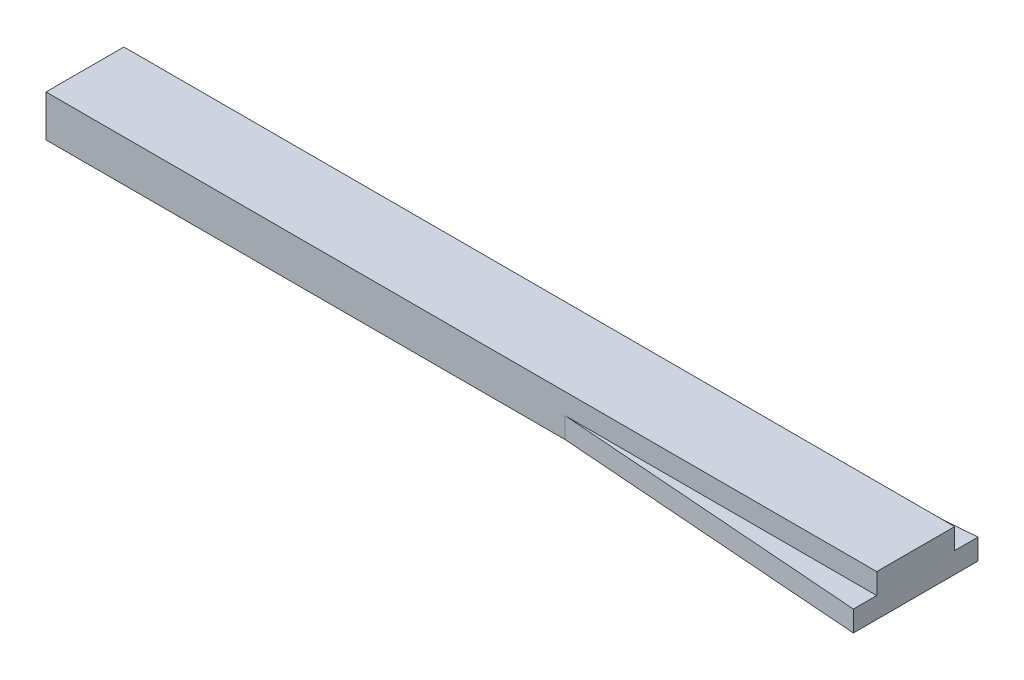
ISO-10303-21;
HEADER;
FILE_DESCRIPTION(('STEP AP214'),'2;1');
FILE_NAME('part.step','',(''),(''),'','','');
FILE_SCHEMA(('AUTOMOTIVE_DESIGN { 1 0 10303 214 1 1 1 1 }'));
ENDSEC;
DATA;
#1=APPLICATION_CONTEXT('core data for automotive mechanical design processes');
#2=APPLICATION_PROTOCOL_DEFINITION('international standard','automotive_design',2000,#1);
#3=PRODUCT_CONTEXT('',#1,'mechanical');
#4=PRODUCT('Part','Part','',(#3));
#5=PRODUCT_RELATED_PRODUCT_CATEGORY('part','',(#4));
#6=PRODUCT_DEFINITION_FORMATION('','',#4);
#7=PRODUCT_DEFINITION_CONTEXT('part definition',#1,'design');
#8=PRODUCT_DEFINITION('design','',#6,#7);
#9=PRODUCT_DEFINITION_SHAPE('','',#8);
#10=(LENGTH_UNIT() NAMED_UNIT(*) SI_UNIT(.MILLI.,.METRE.));
#11=(NAMED_UNIT(*) PLANE_ANGLE_UNIT() SI_UNIT($,.RADIAN.));
#12=(NAMED_UNIT(*) SI_UNIT($,.STERADIAN.) SOLID_ANGLE_UNIT());
#13=UNCERTAINTY_MEASURE_WITH_UNIT(LENGTH_MEASURE(1.E-05),#10,'distance_accuracy_value','');
#14=(GEOMETRIC_REPRESENTATION_CONTEXT(3) GLOBAL_UNCERTAINTY_ASSIGNED_CONTEXT((#13)) GLOBAL_UNIT_ASSIGNED_CONTEXT((#10,
#11,#12)) REPRESENTATION_CONTEXT('',''));
#15=CARTESIAN_POINT('',(0.,0.,0.));
#16=DIRECTION('',(0.,0.,1.));
#17=DIRECTION('',(1.,0.,0.));
#18=AXIS2_PLACEMENT_3D('',#15,#16,#17);
#19=CARTESIAN_POINT('',(-125.993031358885,4.,-49.616724738676));
#20=DIRECTION('',(0.,0.,-1.));
#21=DIRECTION('',(-1.,0.,0.));
#22=AXIS2_PLACEMENT_3D('',#19,#20,#21);
#23=PLANE('',#22);
#24=DIRECTION('',(0.,-1.,0.));
#25=VECTOR('',#24,1.);
#26=CARTESIAN_POINT('',(-125.993031358885,4.,-49.616724738676));
#27=LINE('',#26,#25);
#28=CARTESIAN_POINT('',(-125.993031358885,4.,-49.616724738676));
#29=VERTEX_POINT('',#28);
#30=CARTESIAN_POINT('',(-125.993031358885,-4.,-49.616724738676));
#31=VERTEX_POINT('',#30);
#32=EDGE_CURVE('E106',#29,#31,#27,.T.);
#33=ORIENTED_EDGE('',*,*,#32,.T.);
#34=DIRECTION('',(1.,0.,0.));
#35=VECTOR('',#34,1.);
#36=CARTESIAN_POINT('',(-125.993031358885,-4.,-49.616724738676));
#37=LINE('',#36,#35);
#38=CARTESIAN_POINT('',(-25.993031358885,-4.,-49.6167247386759));
#39=VERTEX_POINT('',#38);
#40=EDGE_CURVE('E109',#31,#39,#37,.T.);
#41=ORIENTED_EDGE('',*,*,#40,.T.);
#42=DIRECTION('',(0.,1.,0.));
#43=VECTOR('',#42,1.);
#44=CARTESIAN_POINT('',(-25.993031358885,-4.,-49.6167247386759));
#45=LINE('',#44,#43);
#46=CARTESIAN_POINT('',(-25.993031358885,0.,-49.6167247386759));
#47=VERTEX_POINT('',#46);
#48=EDGE_CURVE('E151',#39,#47,#45,.T.);
#49=ORIENTED_EDGE('',*,*,#48,.T.);
#50=DIRECTION('',(1.,0.,0.));
#51=VECTOR('',#50,1.);
#52=CARTESIAN_POINT('',(-125.993031358885,0.,-49.616724738676));
#53=LINE('',#52,#51);
#54=CARTESIAN_POINT('',(34.006968641115,0.,-49.616724738676));
#55=VERTEX_POINT('',#54);
#56=EDGE_CURVE('E162',#47,#55,#53,.T.);
#57=ORIENTED_EDGE('',*,*,#56,.T.);
#58=DIRECTION('',(0.,-1.,0.));
#59=VECTOR('',#58,1.);
#60=CARTESIAN_POINT('',(34.006968641115,4.,-49.616724738676));
#61=LINE('',#60,#59);
#62=CARTESIAN_POINT('',(34.006968641115,4.,-49.616724738676));
#63=VERTEX_POINT('',#62);
#64=EDGE_CURVE('E11',#63,#55,#61,.T.);
#65=ORIENTED_EDGE('',*,*,#64,.F.);
#66=DIRECTION('',(1.,0.,0.));
#67=VECTOR('',#66,1.);
#68=CARTESIAN_POINT('',(-125.993031358885,4.,-49.616724738676));
#69=LINE('',#68,#67);
#70=EDGE_CURVE('E111',#29,#63,#69,.T.);
#71=ORIENTED_EDGE('',*,*,#70,.F.);
#72=EDGE_LOOP('',(#33,#41,#49,#57,#65,#71));
#73=FACE_BOUND('',#72,.T.);
#74=ADVANCED_FACE('F41',(#73),#23,.F.);
#75=CARTESIAN_POINT('',(34.006968641115,4.,-49.616724738676));
#76=DIRECTION('',(-1.,0.,0.));
#77=DIRECTION('',(0.,0.,1.));
#78=AXIS2_PLACEMENT_3D('',#75,#76,#77);
#79=PLANE('',#78);
#80=ORIENTED_EDGE('',*,*,#64,.T.);
#81=DIRECTION('',(0.,0.,-1.));
#82=VECTOR('',#81,1.);
#83=CARTESIAN_POINT('',(34.006968641115,0.,-45.1167247386759));
#84=LINE('',#83,#82);
#85=CARTESIAN_POINT('',(34.006968641115,0.,-45.1167247386759));
#86=VERTEX_POINT('',#85);
#87=EDGE_CURVE('E135',#86,#55,#84,.T.);
#88=ORIENTED_EDGE('',*,*,#87,.F.);
#89=DIRECTION('',(0.,1.,0.));
#90=VECTOR('',#89,1.);
#91=CARTESIAN_POINT('',(34.006968641115,-4.,-45.1167247386759));
#92=LINE('',#91,#90);
#93=CARTESIAN_POINT('',(34.006968641115,-4.,-45.1167247386759));
#94=VERTEX_POINT('',#93);
#95=EDGE_CURVE('E167',#94,#86,#92,.T.);
#96=ORIENTED_EDGE('',*,*,#95,.F.);
#97=DIRECTION('',(0.,0.,-1.));
#98=VECTOR('',#97,1.);
#99=CARTESIAN_POINT('',(34.006968641115,-4.,-45.1167247386759));
#100=LINE('',#99,#98);
#101=CARTESIAN_POINT('',(34.006968641115,-4.,-69.116724738676));
#102=VERTEX_POINT('',#101);
#103=EDGE_CURVE('E140',#94,#102,#100,.T.);
#104=ORIENTED_EDGE('',*,*,#103,.T.);
#105=DIRECTION('',(0.,1.,0.));
#106=VECTOR('',#105,1.);
#107=CARTESIAN_POINT('',(34.006968641115,-4.,-69.116724738676));
#108=LINE('',#107,#106);
#109=CARTESIAN_POINT('',(34.006968641115,0.,-69.116724738676));
#110=VERTEX_POINT('',#109);
#111=EDGE_CURVE('E163',#102,#110,#108,.T.);
#112=ORIENTED_EDGE('',*,*,#111,.T.);
#113=CARTESIAN_POINT('',(34.006968641115,0.,-64.616724738676));
#114=VERTEX_POINT('',#113);
#115=EDGE_CURVE('E156',#114,#110,#84,.T.);
#116=ORIENTED_EDGE('',*,*,#115,.F.);
#117=DIRECTION('',(0.,-1.,0.));
#118=VECTOR('',#117,1.);
#119=CARTESIAN_POINT('',(34.006968641115,4.,-64.616724738676));
#120=LINE('',#119,#118);
#121=CARTESIAN_POINT('',(34.006968641115,4.,-64.616724738676));
#122=VERTEX_POINT('',#121);
#123=EDGE_CURVE('E49',#122,#114,#120,.T.);
#124=ORIENTED_EDGE('',*,*,#123,.F.);
#125=DIRECTION('',(0.,0.,-1.));
#126=VECTOR('',#125,1.);
#127=CARTESIAN_POINT('',(34.006968641115,4.,-49.616724738676));
#128=LINE('',#127,#126);
#129=EDGE_CURVE('E174',#63,#122,#128,.T.);
#130=ORIENTED_EDGE('',*,*,#129,.F.);
#131=EDGE_LOOP('',(#80,#88,#96,#104,#112,#116,#124,#130));
#132=FACE_BOUND('',#131,.T.);
#133=ADVANCED_FACE('F196',(#132),#79,.F.);
#134=CARTESIAN_POINT('',(-125.993031358885,4.,-64.616724738676));
#135=DIRECTION('',(0.,0.,1.));
#136=DIRECTION('',(1.,0.,0.));
#137=AXIS2_PLACEMENT_3D('',#134,#135,#136);
#138=PLANE('',#137);
#139=DIRECTION('',(-1.,0.,0.));
#140=VECTOR('',#139,1.);
#141=CARTESIAN_POINT('',(-125.993031358885,0.,-64.616724738676));
#142=LINE('',#141,#140);
#143=CARTESIAN_POINT('',(-25.993031358885,0.,-64.616724738676));
#144=VERTEX_POINT('',#143);
#145=EDGE_CURVE('E175',#114,#144,#142,.T.);
#146=ORIENTED_EDGE('',*,*,#145,.T.);
#147=DIRECTION('',(0.,1.,0.));
#148=VECTOR('',#147,1.);
#149=CARTESIAN_POINT('',(-25.993031358885,-4.,-64.616724738676));
#150=LINE('',#149,#148);
#151=CARTESIAN_POINT('',(-25.993031358885,-4.,-64.616724738676));
#152=VERTEX_POINT('',#151);
#153=EDGE_CURVE('E159',#152,#144,#150,.T.);
#154=ORIENTED_EDGE('',*,*,#153,.F.);
#155=DIRECTION('',(-1.,0.,0.));
#156=VECTOR('',#155,1.);
#157=CARTESIAN_POINT('',(-125.993031358885,-4.,-64.616724738676));
#158=LINE('',#157,#156);
#159=CARTESIAN_POINT('',(-125.993031358885,-4.,-64.616724738676));
#160=VERTEX_POINT('',#159);
#161=EDGE_CURVE('E148',#152,#160,#158,.T.);
#162=ORIENTED_EDGE('',*,*,#161,.T.);
#163=DIRECTION('',(0.,-1.,0.));
#164=VECTOR('',#163,1.);
#165=CARTESIAN_POINT('',(-125.993031358885,4.,-64.616724738676));
#166=LINE('',#165,#164);
#167=CARTESIAN_POINT('',(-125.993031358885,4.,-64.616724738676));
#168=VERTEX_POINT('',#167);
#169=EDGE_CURVE('E115',#168,#160,#166,.T.);
#170=ORIENTED_EDGE('',*,*,#169,.F.);
#171=DIRECTION('',(-1.,0.,0.));
#172=VECTOR('',#171,1.);
#173=CARTESIAN_POINT('',(-125.993031358885,4.,-64.616724738676));
#174=LINE('',#173,#172);
#175=EDGE_CURVE('E61',#122,#168,#174,.T.);
#176=ORIENTED_EDGE('',*,*,#175,.F.);
#177=ORIENTED_EDGE('',*,*,#123,.T.);
#178=EDGE_LOOP('',(#146,#154,#162,#170,#176,#177));
#179=FACE_BOUND('',#178,.T.);
#180=ADVANCED_FACE('F193',(#179),#138,.F.);
#181=CARTESIAN_POINT('',(-125.993031358885,4.,-49.616724738676));
#182=DIRECTION('',(1.,0.,0.));
#183=DIRECTION('',(0.,0.,-1.));
#184=AXIS2_PLACEMENT_3D('',#181,#182,#183);
#185=PLANE('',#184);
#186=ORIENTED_EDGE('',*,*,#169,.T.);
#187=DIRECTION('',(0.,0.,1.));
#188=VECTOR('',#187,1.);
#189=CARTESIAN_POINT('',(-125.993031358885,-4.,-64.616724738676));
#190=LINE('',#189,#188);
#191=EDGE_CURVE('E122',#160,#31,#190,.T.);
#192=ORIENTED_EDGE('',*,*,#191,.T.);
#193=ORIENTED_EDGE('',*,*,#32,.F.);
#194=DIRECTION('',(0.,0.,1.));
#195=VECTOR('',#194,1.);
#196=CARTESIAN_POINT('',(-125.993031358885,4.,-49.616724738676));
#197=LINE('',#196,#195);
#198=EDGE_CURVE('E56',#168,#29,#197,.T.);
#199=ORIENTED_EDGE('',*,*,#198,.F.);
#200=EDGE_LOOP('',(#186,#192,#193,#199));
#201=FACE_BOUND('',#200,.T.);
#202=ADVANCED_FACE('F129',(#201),#185,.F.);
#203=CARTESIAN_POINT('',(0.,4.,0.));
#204=DIRECTION('',(0.,1.,0.));
#205=DIRECTION('',(0.,0.,1.));
#206=AXIS2_PLACEMENT_3D('',#203,#204,#205);
#207=PLANE('',#206);
#208=ORIENTED_EDGE('',*,*,#70,.T.);
#209=ORIENTED_EDGE('',*,*,#129,.T.);
#210=ORIENTED_EDGE('',*,*,#175,.T.);
#211=ORIENTED_EDGE('',*,*,#198,.T.);
#212=EDGE_LOOP('',(#208,#209,#210,#211));
#213=FACE_BOUND('',#212,.T.);
#214=ADVANCED_FACE('F211',(#213),#207,.T.);
#215=CARTESIAN_POINT('',(0.,0.,0.));
#216=DIRECTION('',(0.,1.,0.));
#217=DIRECTION('',(0.,0.,1.));
#218=AXIS2_PLACEMENT_3D('',#215,#216,#217);
#219=PLANE('',#218);
#220=ORIENTED_EDGE('',*,*,#56,.F.);
#221=DIRECTION('',(0.997199309888456,0.,0.0747899482416341));
#222=VECTOR('',#221,1.);
#223=CARTESIAN_POINT('',(-25.993031358885,0.,-49.6167247386759));
#224=LINE('',#223,#222);
#225=EDGE_CURVE('E152',#47,#86,#224,.T.);
#226=ORIENTED_EDGE('',*,*,#225,.T.);
#227=ORIENTED_EDGE('',*,*,#87,.T.);
#228=EDGE_LOOP('',(#220,#226,#227));
#229=FACE_BOUND('',#228,.T.);
#230=ADVANCED_FACE('F209',(#229),#219,.T.);
#231=ORIENTED_EDGE('',*,*,#145,.F.);
#232=ORIENTED_EDGE('',*,*,#115,.T.);
#233=DIRECTION('',(-0.997199309888456,0.,0.0747899482416341));
#234=VECTOR('',#233,1.);
#235=CARTESIAN_POINT('',(-25.993031358885,0.,-64.616724738676));
#236=LINE('',#235,#234);
#237=EDGE_CURVE('E131',#110,#144,#236,.T.);
#238=ORIENTED_EDGE('',*,*,#237,.T.);
#239=EDGE_LOOP('',(#231,#232,#238));
#240=FACE_BOUND('',#239,.T.);
#241=ADVANCED_FACE('F200',(#240),#219,.T.);
#242=CARTESIAN_POINT('',(-25.993031358885,-4.,-64.616724738676));
#243=DIRECTION('',(-0.0747899482416341,0.,-0.997199309888457));
#244=DIRECTION('',(-0.997199309888457,0.,0.0747899482416341));
#245=AXIS2_PLACEMENT_3D('',#242,#243,#244);
#246=PLANE('',#245);
#247=ORIENTED_EDGE('',*,*,#237,.F.);
#248=ORIENTED_EDGE('',*,*,#111,.F.);
#249=DIRECTION('',(-0.997199309888456,0.,0.0747899482416341));
#250=VECTOR('',#249,1.);
#251=CARTESIAN_POINT('',(-25.993031358885,-4.,-64.616724738676));
#252=LINE('',#251,#250);
#253=EDGE_CURVE('E144',#102,#152,#252,.T.);
#254=ORIENTED_EDGE('',*,*,#253,.T.);
#255=ORIENTED_EDGE('',*,*,#153,.T.);
#256=EDGE_LOOP('',(#247,#248,#254,#255));
#257=FACE_BOUND('',#256,.T.);
#258=ADVANCED_FACE('F202',(#257),#246,.T.);
#259=CARTESIAN_POINT('',(-25.993031358885,-4.,-49.6167247386759));
#260=DIRECTION('',(-0.0747899482416341,0.,0.997199309888457));
#261=DIRECTION('',(0.997199309888457,0.,0.0747899482416341));
#262=AXIS2_PLACEMENT_3D('',#259,#260,#261);
#263=PLANE('',#262);
#264=ORIENTED_EDGE('',*,*,#225,.F.);
#265=ORIENTED_EDGE('',*,*,#48,.F.);
#266=DIRECTION('',(0.997199309888456,0.,0.0747899482416341));
#267=VECTOR('',#266,1.);
#268=CARTESIAN_POINT('',(-25.993031358885,-4.,-49.6167247386759));
#269=LINE('',#268,#267);
#270=EDGE_CURVE('E126',#39,#94,#269,.T.);
#271=ORIENTED_EDGE('',*,*,#270,.T.);
#272=ORIENTED_EDGE('',*,*,#95,.T.);
#273=EDGE_LOOP('',(#264,#265,#271,#272));
#274=FACE_BOUND('',#273,.T.);
#275=ADVANCED_FACE('F207',(#274),#263,.T.);
#276=CARTESIAN_POINT('',(0.,-4.,0.));
#277=DIRECTION('',(0.,1.,0.));
#278=DIRECTION('',(0.,0.,1.));
#279=AXIS2_PLACEMENT_3D('',#276,#277,#278);
#280=PLANE('',#279);
#281=ORIENTED_EDGE('',*,*,#191,.F.);
#282=ORIENTED_EDGE('',*,*,#161,.F.);
#283=ORIENTED_EDGE('',*,*,#253,.F.);
#284=ORIENTED_EDGE('',*,*,#103,.F.);
#285=ORIENTED_EDGE('',*,*,#270,.F.);
#286=ORIENTED_EDGE('',*,*,#40,.F.);
#287=EDGE_LOOP('',(#281,#282,#283,#284,#285,#286));
#288=FACE_BOUND('',#287,.T.);
#289=ADVANCED_FACE('F120',(#288),#280,.F.);
#290=CLOSED_SHELL('',(#74,#133,#180,#202,#214,#230,#241,#258,#275,#289));
#291=MANIFOLD_SOLID_BREP('B2',#290);
#292=ADVANCED_BREP_SHAPE_REPRESENTATION('',(#18,#291),#14);
#293=SHAPE_DEFINITION_REPRESENTATION(#9,#292);
ENDSEC;
END-ISO-10303-21;
